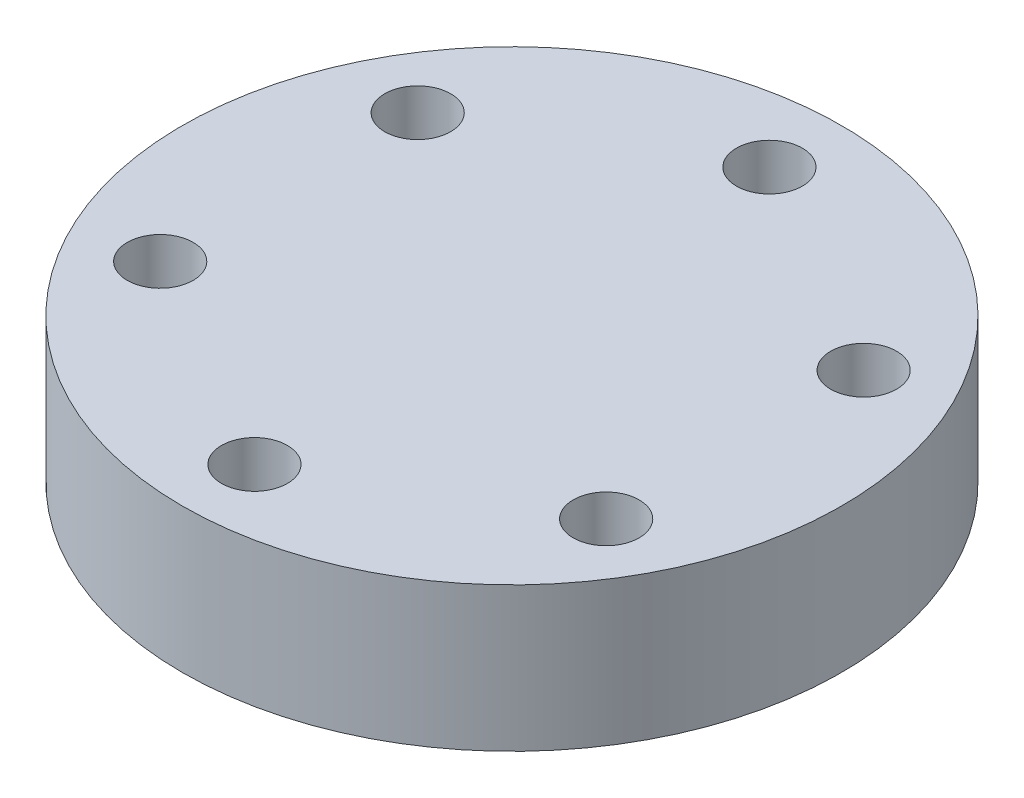
ISO-10303-21;
HEADER;
FILE_DESCRIPTION(('STEP AP214'),'2;1');
FILE_NAME('part.step','',(''),(''),'','','');
FILE_SCHEMA(('AUTOMOTIVE_DESIGN { 1 0 10303 214 1 1 1 1 }'));
ENDSEC;
DATA;
#1=APPLICATION_CONTEXT('core data for automotive mechanical design processes');
#2=APPLICATION_PROTOCOL_DEFINITION('international standard','automotive_design',2000,#1);
#3=PRODUCT_CONTEXT('',#1,'mechanical');
#4=PRODUCT('Part','Part','',(#3));
#5=PRODUCT_RELATED_PRODUCT_CATEGORY('part','',(#4));
#6=PRODUCT_DEFINITION_FORMATION('','',#4);
#7=PRODUCT_DEFINITION_CONTEXT('part definition',#1,'design');
#8=PRODUCT_DEFINITION('design','',#6,#7);
#9=PRODUCT_DEFINITION_SHAPE('','',#8);
#10=(LENGTH_UNIT() NAMED_UNIT(*) SI_UNIT(.MILLI.,.METRE.));
#11=(NAMED_UNIT(*) PLANE_ANGLE_UNIT() SI_UNIT($,.RADIAN.));
#12=(NAMED_UNIT(*) SI_UNIT($,.STERADIAN.) SOLID_ANGLE_UNIT());
#13=UNCERTAINTY_MEASURE_WITH_UNIT(LENGTH_MEASURE(1.E-05),#10,'distance_accuracy_value','');
#14=(GEOMETRIC_REPRESENTATION_CONTEXT(3) GLOBAL_UNCERTAINTY_ASSIGNED_CONTEXT((#13)) GLOBAL_UNIT_ASSIGNED_CONTEXT((#10,
#11,#12)) REPRESENTATION_CONTEXT('',''));
#15=CARTESIAN_POINT('',(0.,0.,0.));
#16=DIRECTION('',(0.,0.,1.));
#17=DIRECTION('',(1.,0.,0.));
#18=AXIS2_PLACEMENT_3D('',#15,#16,#17);
#19=CARTESIAN_POINT('',(0.,5.,0.));
#20=DIRECTION('',(0.,-1.,0.));
#21=DIRECTION('',(0.,0.,-1.));
#22=AXIS2_PLACEMENT_3D('',#19,#20,#21);
#23=CYLINDRICAL_SURFACE('',#22,16.);
#24=CARTESIAN_POINT('',(0.,0.,0.));
#25=DIRECTION('',(0.,1.,0.));
#26=DIRECTION('',(0.,0.,1.));
#27=AXIS2_PLACEMENT_3D('',#24,#25,#26);
#28=CIRCLE('',#27,16.);
#29=CARTESIAN_POINT('',(0.,0.,16.));
#30=VERTEX_POINT('',#29);
#31=EDGE_CURVE('E10',#30,#30,#28,.T.);
#32=ORIENTED_EDGE('',*,*,#31,.T.);
#33=EDGE_LOOP('',(#32));
#34=FACE_BOUND('',#33,.T.);
#35=CARTESIAN_POINT('',(0.,7.,0.));
#36=DIRECTION('',(0.,1.,0.));
#37=DIRECTION('',(0.,0.,1.));
#38=AXIS2_PLACEMENT_3D('',#35,#36,#37);
#39=CIRCLE('',#38,16.);
#40=CARTESIAN_POINT('',(0.,7.,16.));
#41=VERTEX_POINT('',#40);
#42=EDGE_CURVE('E45',#41,#41,#39,.T.);
#43=ORIENTED_EDGE('',*,*,#42,.F.);
#44=EDGE_LOOP('',(#43));
#45=FACE_BOUND('',#44,.T.);
#46=ADVANCED_FACE('F39',(#34,#45),#23,.T.);
#47=CARTESIAN_POINT('',(0.,0.,0.));
#48=DIRECTION('',(0.,1.,0.));
#49=DIRECTION('',(0.,0.,1.));
#50=AXIS2_PLACEMENT_3D('',#47,#48,#49);
#51=PLANE('',#50);
#52=CARTESIAN_POINT('',(0.,0.,-12.5));
#53=DIRECTION('',(0.,1.,0.));
#54=DIRECTION('',(0.,0.,1.));
#55=AXIS2_PLACEMENT_3D('',#52,#53,#54);
#56=CIRCLE('',#55,1.6);
#57=CARTESIAN_POINT('',(0.,0.,-10.9));
#58=VERTEX_POINT('',#57);
#59=EDGE_CURVE('E49',#58,#58,#56,.T.);
#60=ORIENTED_EDGE('',*,*,#59,.T.);
#61=EDGE_LOOP('',(#60));
#62=FACE_BOUND('',#61,.T.);
#63=CARTESIAN_POINT('',(-10.8253175473054,0.,-6.25000000000013));
#64=DIRECTION('',(0.,1.,0.));
#65=DIRECTION('',(0.,0.,1.));
#66=AXIS2_PLACEMENT_3D('',#63,#64,#65);
#67=CIRCLE('',#66,1.6);
#68=CARTESIAN_POINT('',(-10.8253175473054,0.,-4.65000000000013));
#69=VERTEX_POINT('',#68);
#70=EDGE_CURVE('E81',#69,#69,#67,.T.);
#71=ORIENTED_EDGE('',*,*,#70,.T.);
#72=EDGE_LOOP('',(#71));
#73=FACE_BOUND('',#72,.T.);
#74=CARTESIAN_POINT('',(-10.8253175473055,0.,6.2499999999999));
#75=DIRECTION('',(0.,1.,0.));
#76=DIRECTION('',(0.,0.,1.));
#77=AXIS2_PLACEMENT_3D('',#74,#75,#76);
#78=CIRCLE('',#77,1.6);
#79=CARTESIAN_POINT('',(-10.8253175473055,0.,7.8499999999999));
#80=VERTEX_POINT('',#79);
#81=EDGE_CURVE('E56',#80,#80,#78,.T.);
#82=ORIENTED_EDGE('',*,*,#81,.T.);
#83=EDGE_LOOP('',(#82));
#84=FACE_BOUND('',#83,.T.);
#85=CARTESIAN_POINT('',(0.,0.,12.5));
#86=DIRECTION('',(0.,1.,0.));
#87=DIRECTION('',(0.,0.,1.));
#88=AXIS2_PLACEMENT_3D('',#85,#86,#87);
#89=CIRCLE('',#88,1.6);
#90=CARTESIAN_POINT('',(0.,0.,14.1));
#91=VERTEX_POINT('',#90);
#92=EDGE_CURVE('E63',#91,#91,#89,.T.);
#93=ORIENTED_EDGE('',*,*,#92,.T.);
#94=EDGE_LOOP('',(#93));
#95=FACE_BOUND('',#94,.T.);
#96=CARTESIAN_POINT('',(10.8253175473055,0.,6.25000000000005));
#97=DIRECTION('',(0.,1.,0.));
#98=DIRECTION('',(0.,0.,1.));
#99=AXIS2_PLACEMENT_3D('',#96,#97,#98);
#100=CIRCLE('',#99,1.6);
#101=CARTESIAN_POINT('',(10.8253175473055,0.,7.85000000000005));
#102=VERTEX_POINT('',#101);
#103=EDGE_CURVE('E69',#102,#102,#100,.T.);
#104=ORIENTED_EDGE('',*,*,#103,.T.);
#105=EDGE_LOOP('',(#104));
#106=FACE_BOUND('',#105,.T.);
#107=CARTESIAN_POINT('',(10.8253175473055,0.,-6.24999999999998));
#108=DIRECTION('',(0.,1.,0.));
#109=DIRECTION('',(0.,0.,1.));
#110=AXIS2_PLACEMENT_3D('',#107,#108,#109);
#111=CIRCLE('',#110,1.6);
#112=CARTESIAN_POINT('',(10.8253175473055,0.,-4.64999999999998));
#113=VERTEX_POINT('',#112);
#114=EDGE_CURVE('E75',#113,#113,#111,.T.);
#115=ORIENTED_EDGE('',*,*,#114,.T.);
#116=EDGE_LOOP('',(#115));
#117=FACE_BOUND('',#116,.T.);
#118=ORIENTED_EDGE('',*,*,#31,.F.);
#119=EDGE_LOOP('',(#118));
#120=FACE_BOUND('',#119,.T.);
#121=ADVANCED_FACE('F95',(#62,#73,#84,#95,#106,#117,#120),#51,.F.);
#122=CARTESIAN_POINT('',(0.,7.,0.));
#123=DIRECTION('',(0.,1.,0.));
#124=DIRECTION('',(0.,0.,1.));
#125=AXIS2_PLACEMENT_3D('',#122,#123,#124);
#126=PLANE('',#125);
#127=CARTESIAN_POINT('',(0.,7.,-12.5));
#128=DIRECTION('',(0.,1.,0.));
#129=DIRECTION('',(0.,0.,1.));
#130=AXIS2_PLACEMENT_3D('',#127,#128,#129);
#131=CIRCLE('',#130,1.6);
#132=CARTESIAN_POINT('',(0.,7.,-10.9));
#133=VERTEX_POINT('',#132);
#134=EDGE_CURVE('E53',#133,#133,#131,.T.);
#135=ORIENTED_EDGE('',*,*,#134,.F.);
#136=EDGE_LOOP('',(#135));
#137=FACE_BOUND('',#136,.T.);
#138=CARTESIAN_POINT('',(-10.8253175473054,7.,-6.25000000000013));
#139=DIRECTION('',(0.,1.,0.));
#140=DIRECTION('',(0.,0.,1.));
#141=AXIS2_PLACEMENT_3D('',#138,#139,#140);
#142=CIRCLE('',#141,1.6);
#143=CARTESIAN_POINT('',(-10.8253175473054,7.,-4.65000000000013));
#144=VERTEX_POINT('',#143);
#145=EDGE_CURVE('E60',#144,#144,#142,.T.);
#146=ORIENTED_EDGE('',*,*,#145,.F.);
#147=EDGE_LOOP('',(#146));
#148=FACE_BOUND('',#147,.T.);
#149=CARTESIAN_POINT('',(-10.8253175473055,7.,6.2499999999999));
#150=DIRECTION('',(0.,1.,0.));
#151=DIRECTION('',(0.,0.,1.));
#152=AXIS2_PLACEMENT_3D('',#149,#150,#151);
#153=CIRCLE('',#152,1.6);
#154=CARTESIAN_POINT('',(-10.8253175473055,7.,7.8499999999999));
#155=VERTEX_POINT('',#154);
#156=EDGE_CURVE('E59',#155,#155,#153,.T.);
#157=ORIENTED_EDGE('',*,*,#156,.F.);
#158=EDGE_LOOP('',(#157));
#159=FACE_BOUND('',#158,.T.);
#160=CARTESIAN_POINT('',(0.,7.,12.5));
#161=DIRECTION('',(0.,1.,0.));
#162=DIRECTION('',(0.,0.,1.));
#163=AXIS2_PLACEMENT_3D('',#160,#161,#162);
#164=CIRCLE('',#163,1.6);
#165=CARTESIAN_POINT('',(0.,7.,14.1));
#166=VERTEX_POINT('',#165);
#167=EDGE_CURVE('E66',#166,#166,#164,.T.);
#168=ORIENTED_EDGE('',*,*,#167,.F.);
#169=EDGE_LOOP('',(#168));
#170=FACE_BOUND('',#169,.T.);
#171=CARTESIAN_POINT('',(10.8253175473055,7.,6.25000000000005));
#172=DIRECTION('',(0.,1.,0.));
#173=DIRECTION('',(0.,0.,1.));
#174=AXIS2_PLACEMENT_3D('',#171,#172,#173);
#175=CIRCLE('',#174,1.6);
#176=CARTESIAN_POINT('',(10.8253175473055,7.,7.85000000000005));
#177=VERTEX_POINT('',#176);
#178=EDGE_CURVE('E72',#177,#177,#175,.T.);
#179=ORIENTED_EDGE('',*,*,#178,.F.);
#180=EDGE_LOOP('',(#179));
#181=FACE_BOUND('',#180,.T.);
#182=CARTESIAN_POINT('',(10.8253175473055,7.,-6.24999999999998));
#183=DIRECTION('',(0.,1.,0.));
#184=DIRECTION('',(0.,0.,1.));
#185=AXIS2_PLACEMENT_3D('',#182,#183,#184);
#186=CIRCLE('',#185,1.6);
#187=CARTESIAN_POINT('',(10.8253175473055,7.,-4.64999999999998));
#188=VERTEX_POINT('',#187);
#189=EDGE_CURVE('E78',#188,#188,#186,.T.);
#190=ORIENTED_EDGE('',*,*,#189,.F.);
#191=EDGE_LOOP('',(#190));
#192=FACE_BOUND('',#191,.T.);
#193=ORIENTED_EDGE('',*,*,#42,.T.);
#194=EDGE_LOOP('',(#193));
#195=FACE_BOUND('',#194,.T.);
#196=ADVANCED_FACE('F91',(#137,#148,#159,#170,#181,#192,#195),#126,.T.);
#197=CARTESIAN_POINT('',(10.8253175473055,0.,-6.24999999999998));
#198=DIRECTION('',(0.,1.,0.));
#199=DIRECTION('',(0.,0.,1.));
#200=AXIS2_PLACEMENT_3D('',#197,#198,#199);
#201=CYLINDRICAL_SURFACE('',#200,1.6);
#202=ORIENTED_EDGE('',*,*,#114,.F.);
#203=EDGE_LOOP('',(#202));
#204=FACE_BOUND('',#203,.T.);
#205=ORIENTED_EDGE('',*,*,#189,.T.);
#206=EDGE_LOOP('',(#205));
#207=FACE_BOUND('',#206,.T.);
#208=ADVANCED_FACE('F94',(#204,#207),#201,.F.);
#209=CARTESIAN_POINT('',(10.8253175473055,0.,6.25000000000005));
#210=DIRECTION('',(0.,1.,0.));
#211=DIRECTION('',(0.,0.,1.));
#212=AXIS2_PLACEMENT_3D('',#209,#210,#211);
#213=CYLINDRICAL_SURFACE('',#212,1.6);
#214=ORIENTED_EDGE('',*,*,#103,.F.);
#215=EDGE_LOOP('',(#214));
#216=FACE_BOUND('',#215,.T.);
#217=ORIENTED_EDGE('',*,*,#178,.T.);
#218=EDGE_LOOP('',(#217));
#219=FACE_BOUND('',#218,.T.);
#220=ADVANCED_FACE('F108',(#216,#219),#213,.F.);
#221=CARTESIAN_POINT('',(0.,0.,12.5));
#222=DIRECTION('',(0.,1.,0.));
#223=DIRECTION('',(0.,0.,1.));
#224=AXIS2_PLACEMENT_3D('',#221,#222,#223);
#225=CYLINDRICAL_SURFACE('',#224,1.6);
#226=ORIENTED_EDGE('',*,*,#92,.F.);
#227=EDGE_LOOP('',(#226));
#228=FACE_BOUND('',#227,.T.);
#229=ORIENTED_EDGE('',*,*,#167,.T.);
#230=EDGE_LOOP('',(#229));
#231=FACE_BOUND('',#230,.T.);
#232=ADVANCED_FACE('F114',(#228,#231),#225,.F.);
#233=CARTESIAN_POINT('',(-10.8253175473055,0.,6.2499999999999));
#234=DIRECTION('',(0.,1.,0.));
#235=DIRECTION('',(0.,0.,1.));
#236=AXIS2_PLACEMENT_3D('',#233,#234,#235);
#237=CYLINDRICAL_SURFACE('',#236,1.6);
#238=ORIENTED_EDGE('',*,*,#81,.F.);
#239=EDGE_LOOP('',(#238));
#240=FACE_BOUND('',#239,.T.);
#241=ORIENTED_EDGE('',*,*,#156,.T.);
#242=EDGE_LOOP('',(#241));
#243=FACE_BOUND('',#242,.T.);
#244=ADVANCED_FACE('F129',(#240,#243),#237,.F.);
#245=CARTESIAN_POINT('',(-10.8253175473054,0.,-6.25000000000013));
#246=DIRECTION('',(0.,1.,0.));
#247=DIRECTION('',(0.,0.,1.));
#248=AXIS2_PLACEMENT_3D('',#245,#246,#247);
#249=CYLINDRICAL_SURFACE('',#248,1.6);
#250=ORIENTED_EDGE('',*,*,#70,.F.);
#251=EDGE_LOOP('',(#250));
#252=FACE_BOUND('',#251,.T.);
#253=ORIENTED_EDGE('',*,*,#145,.T.);
#254=EDGE_LOOP('',(#253));
#255=FACE_BOUND('',#254,.T.);
#256=ADVANCED_FACE('F132',(#252,#255),#249,.F.);
#257=CARTESIAN_POINT('',(0.,0.,-12.5));
#258=DIRECTION('',(0.,1.,0.));
#259=DIRECTION('',(0.,0.,1.));
#260=AXIS2_PLACEMENT_3D('',#257,#258,#259);
#261=CYLINDRICAL_SURFACE('',#260,1.6);
#262=ORIENTED_EDGE('',*,*,#59,.F.);
#263=EDGE_LOOP('',(#262));
#264=FACE_BOUND('',#263,.T.);
#265=ORIENTED_EDGE('',*,*,#134,.T.);
#266=EDGE_LOOP('',(#265));
#267=FACE_BOUND('',#266,.T.);
#268=ADVANCED_FACE('F89',(#264,#267),#261,.F.);
#269=CLOSED_SHELL('',(#46,#121,#196,#208,#220,#232,#244,#256,#268));
#270=MANIFOLD_SOLID_BREP('B2',#269);
#271=ADVANCED_BREP_SHAPE_REPRESENTATION('',(#18,#270),#14);
#272=SHAPE_DEFINITION_REPRESENTATION(#9,#271);
ENDSEC;
END-ISO-10303-21;
